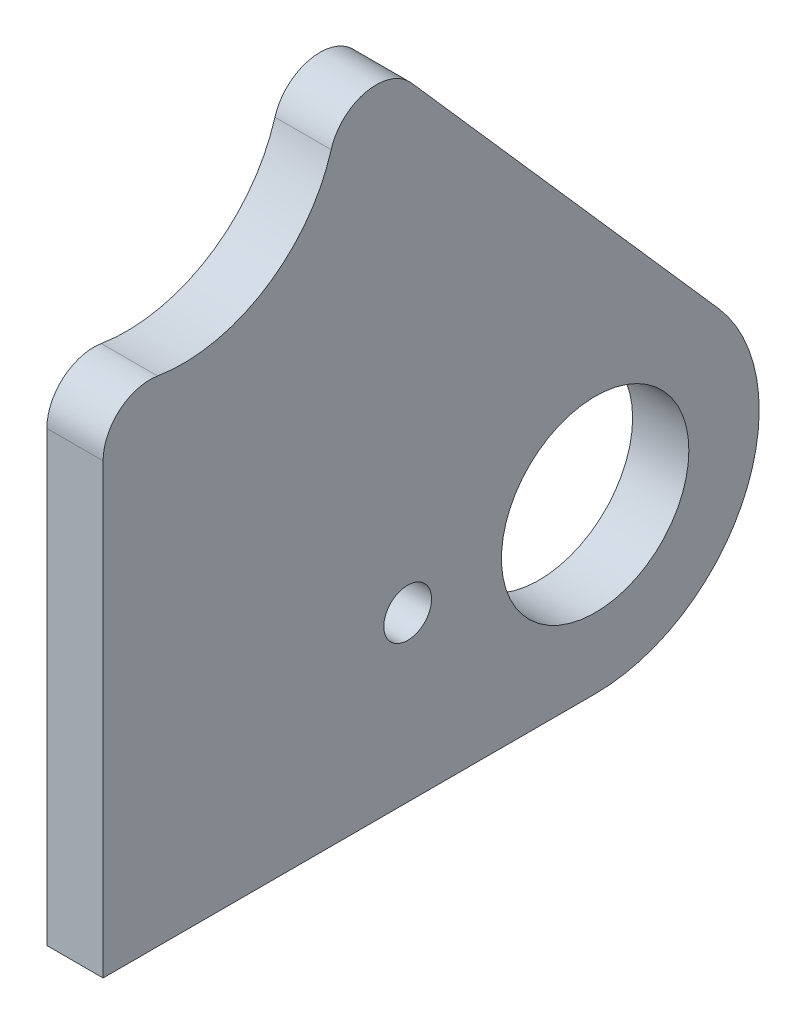
ISO-10303-21;
HEADER;
FILE_DESCRIPTION(('STEP AP214'),'2;1');
FILE_NAME('part.step','',(''),(''),'','','');
FILE_SCHEMA(('AUTOMOTIVE_DESIGN { 1 0 10303 214 1 1 1 1 }'));
ENDSEC;
DATA;
#1=APPLICATION_CONTEXT('core data for automotive mechanical design processes');
#2=APPLICATION_PROTOCOL_DEFINITION('international standard','automotive_design',2000,#1);
#3=PRODUCT_CONTEXT('',#1,'mechanical');
#4=PRODUCT('Part','Part','',(#3));
#5=PRODUCT_RELATED_PRODUCT_CATEGORY('part','',(#4));
#6=PRODUCT_DEFINITION_FORMATION('','',#4);
#7=PRODUCT_DEFINITION_CONTEXT('part definition',#1,'design');
#8=PRODUCT_DEFINITION('design','',#6,#7);
#9=PRODUCT_DEFINITION_SHAPE('','',#8);
#10=(LENGTH_UNIT() NAMED_UNIT(*) SI_UNIT(.MILLI.,.METRE.));
#11=(NAMED_UNIT(*) PLANE_ANGLE_UNIT() SI_UNIT($,.RADIAN.));
#12=(NAMED_UNIT(*) SI_UNIT($,.STERADIAN.) SOLID_ANGLE_UNIT());
#13=UNCERTAINTY_MEASURE_WITH_UNIT(LENGTH_MEASURE(1.E-05),#10,'distance_accuracy_value','');
#14=(GEOMETRIC_REPRESENTATION_CONTEXT(3) GLOBAL_UNCERTAINTY_ASSIGNED_CONTEXT((#13)) GLOBAL_UNIT_ASSIGNED_CONTEXT((#10,
#11,#12)) REPRESENTATION_CONTEXT('',''));
#15=CARTESIAN_POINT('',(0.,0.,0.));
#16=DIRECTION('',(0.,0.,1.));
#17=DIRECTION('',(1.,0.,0.));
#18=AXIS2_PLACEMENT_3D('',#15,#16,#17);
#19=CARTESIAN_POINT('',(12.,35.,-105.));
#20=DIRECTION('',(1.,0.,0.));
#21=DIRECTION('',(0.,0.,-1.));
#22=AXIS2_PLACEMENT_3D('',#19,#20,#21);
#23=PLANE('',#22);
#24=CARTESIAN_POINT('',(12.,35.,-65.));
#25=DIRECTION('',(1.,0.,0.));
#26=DIRECTION('',(0.,0.,-1.));
#27=AXIS2_PLACEMENT_3D('',#24,#25,#26);
#28=CIRCLE('',#27,5.09999999999999);
#29=CARTESIAN_POINT('',(12.,35.,-70.1));
#30=VERTEX_POINT('',#29);
#31=EDGE_CURVE('E174',#30,#30,#28,.T.);
#32=ORIENTED_EDGE('',*,*,#31,.F.);
#33=EDGE_LOOP('',(#32));
#34=FACE_BOUND('',#33,.T.);
#35=DIRECTION('',(0.,0.750625157442999,0.660728289854213));
#36=VECTOR('',#35,1.);
#37=CARTESIAN_POINT('',(12.,159.804033565189,-41.770630195619));
#38=LINE('',#37,#36);
#39=CARTESIAN_POINT('',(12.,58.1254901448974,-131.271880510505));
#40=VERTEX_POINT('',#39);
#41=CARTESIAN_POINT('',(12.,132.532467280468,-65.776081084491));
#42=VERTEX_POINT('',#41);
#43=EDGE_CURVE('E106',#40,#42,#38,.T.);
#44=ORIENTED_EDGE('',*,*,#43,.T.);
#45=CARTESIAN_POINT('',(12.,125.925184381926,-58.269829510061));
#46=DIRECTION('',(1.,0.,0.));
#47=DIRECTION('',(0.,0.,-1.));
#48=AXIS2_PLACEMENT_3D('',#45,#46,#47);
#49=CIRCLE('',#48,10.);
#50=CARTESIAN_POINT('',(12.,128.733281037292,-48.6721947402794));
#51=VERTEX_POINT('',#50);
#52=EDGE_CURVE('E44',#42,#51,#49,.T.);
#53=ORIENTED_EDGE('',*,*,#52,.T.);
#54=CARTESIAN_POINT('',(12.,138.,-17.));
#55=DIRECTION('',(-1.,0.,0.));
#56=DIRECTION('',(0.,0.,-1.));
#57=AXIS2_PLACEMENT_3D('',#54,#55,#56);
#58=CIRCLE('',#57,33.);
#59=CARTESIAN_POINT('',(12.,105.440199377922,-11.6279069767442));
#60=VERTEX_POINT('',#59);
#61=EDGE_CURVE('E137',#51,#60,#58,.T.);
#62=ORIENTED_EDGE('',*,*,#61,.T.);
#63=CARTESIAN_POINT('',(12.,95.5735931288071,-10.));
#64=DIRECTION('',(1.,0.,0.));
#65=DIRECTION('',(0.,0.,-1.));
#66=AXIS2_PLACEMENT_3D('',#63,#64,#65);
#67=CIRCLE('',#66,10.);
#68=CARTESIAN_POINT('',(12.,95.5735931288071,0.));
#69=VERTEX_POINT('',#68);
#70=EDGE_CURVE('E51',#60,#69,#67,.T.);
#71=ORIENTED_EDGE('',*,*,#70,.T.);
#72=DIRECTION('',(0.,-1.,0.));
#73=VECTOR('',#72,1.);
#74=CARTESIAN_POINT('',(12.,0.,0.));
#75=LINE('',#74,#73);
#76=CARTESIAN_POINT('',(12.,0.,0.));
#77=VERTEX_POINT('',#76);
#78=EDGE_CURVE('E111',#69,#77,#75,.T.);
#79=ORIENTED_EDGE('',*,*,#78,.T.);
#80=DIRECTION('',(0.,0.,-1.));
#81=VECTOR('',#80,1.);
#82=CARTESIAN_POINT('',(12.,0.,0.));
#83=LINE('',#82,#81);
#84=CARTESIAN_POINT('',(12.,0.,-105.));
#85=VERTEX_POINT('',#84);
#86=EDGE_CURVE('E107',#77,#85,#83,.T.);
#87=ORIENTED_EDGE('',*,*,#86,.T.);
#88=CARTESIAN_POINT('',(12.,35.,-105.));
#89=DIRECTION('',(1.,0.,0.));
#90=DIRECTION('',(0.,0.,-1.));
#91=AXIS2_PLACEMENT_3D('',#88,#89,#90);
#92=CIRCLE('',#91,35.);
#93=EDGE_CURVE('E98',#85,#40,#92,.T.);
#94=ORIENTED_EDGE('',*,*,#93,.T.);
#95=EDGE_LOOP('',(#44,#53,#62,#71,#79,#87,#94));
#96=FACE_BOUND('',#95,.T.);
#97=CARTESIAN_POINT('',(12.,35.,-105.));
#98=DIRECTION('',(1.,0.,0.));
#99=DIRECTION('',(0.,0.,-1.));
#100=AXIS2_PLACEMENT_3D('',#97,#98,#99);
#101=CIRCLE('',#100,20.);
#102=CARTESIAN_POINT('',(12.,35.,-125.));
#103=VERTEX_POINT('',#102);
#104=EDGE_CURVE('E162',#103,#103,#101,.T.);
#105=ORIENTED_EDGE('',*,*,#104,.F.);
#106=EDGE_LOOP('',(#105));
#107=FACE_BOUND('',#106,.T.);
#108=ADVANCED_FACE('F36',(#34,#96,#107),#23,.T.);
#109=CARTESIAN_POINT('',(0.,35.,-105.));
#110=DIRECTION('',(1.,0.,0.));
#111=DIRECTION('',(0.,0.,-1.));
#112=AXIS2_PLACEMENT_3D('',#109,#110,#111);
#113=PLANE('',#112);
#114=CARTESIAN_POINT('',(0.,35.,-65.));
#115=DIRECTION('',(1.,0.,0.));
#116=DIRECTION('',(0.,0.,-1.));
#117=AXIS2_PLACEMENT_3D('',#114,#115,#116);
#118=CIRCLE('',#117,5.09999999999999);
#119=CARTESIAN_POINT('',(0.,35.,-70.1));
#120=VERTEX_POINT('',#119);
#121=EDGE_CURVE('E169',#120,#120,#118,.T.);
#122=ORIENTED_EDGE('',*,*,#121,.T.);
#123=EDGE_LOOP('',(#122));
#124=FACE_BOUND('',#123,.T.);
#125=CARTESIAN_POINT('',(0.,138.,-17.));
#126=DIRECTION('',(-1.,0.,0.));
#127=DIRECTION('',(0.,0.,-1.));
#128=AXIS2_PLACEMENT_3D('',#125,#126,#127);
#129=CIRCLE('',#128,33.);
#130=CARTESIAN_POINT('',(0.,128.733281037292,-48.6721947402794));
#131=VERTEX_POINT('',#130);
#132=CARTESIAN_POINT('',(0.,105.440199377922,-11.6279069767442));
#133=VERTEX_POINT('',#132);
#134=EDGE_CURVE('E152',#131,#133,#129,.T.);
#135=ORIENTED_EDGE('',*,*,#134,.F.);
#136=CARTESIAN_POINT('',(0.,125.925184381926,-58.269829510061));
#137=DIRECTION('',(1.,0.,0.));
#138=DIRECTION('',(0.,0.,-1.));
#139=AXIS2_PLACEMENT_3D('',#136,#137,#138);
#140=CIRCLE('',#139,10.);
#141=CARTESIAN_POINT('',(0.,132.532467280468,-65.776081084491));
#142=VERTEX_POINT('',#141);
#143=EDGE_CURVE('E132',#131,#142,#140,.F.);
#144=ORIENTED_EDGE('',*,*,#143,.T.);
#145=DIRECTION('',(0.,0.750625157442999,0.660728289854213));
#146=VECTOR('',#145,1.);
#147=CARTESIAN_POINT('',(0.,159.804033565189,-41.770630195619));
#148=LINE('',#147,#146);
#149=CARTESIAN_POINT('',(0.,58.1254901448974,-131.271880510505));
#150=VERTEX_POINT('',#149);
#151=EDGE_CURVE('E151',#150,#142,#148,.T.);
#152=ORIENTED_EDGE('',*,*,#151,.F.);
#153=CARTESIAN_POINT('',(0.,35.,-105.));
#154=DIRECTION('',(1.,0.,0.));
#155=DIRECTION('',(0.,0.,-1.));
#156=AXIS2_PLACEMENT_3D('',#153,#154,#155);
#157=CIRCLE('',#156,35.);
#158=CARTESIAN_POINT('',(0.,0.,-105.));
#159=VERTEX_POINT('',#158);
#160=EDGE_CURVE('E154',#159,#150,#157,.T.);
#161=ORIENTED_EDGE('',*,*,#160,.F.);
#162=DIRECTION('',(0.,0.,-1.));
#163=VECTOR('',#162,1.);
#164=CARTESIAN_POINT('',(0.,0.,0.));
#165=LINE('',#164,#163);
#166=CARTESIAN_POINT('',(0.,0.,0.));
#167=VERTEX_POINT('',#166);
#168=EDGE_CURVE('E119',#167,#159,#165,.T.);
#169=ORIENTED_EDGE('',*,*,#168,.F.);
#170=DIRECTION('',(0.,-1.,0.));
#171=VECTOR('',#170,1.);
#172=CARTESIAN_POINT('',(0.,0.,0.));
#173=LINE('',#172,#171);
#174=CARTESIAN_POINT('',(0.,95.5735931288071,0.));
#175=VERTEX_POINT('',#174);
#176=EDGE_CURVE('E115',#175,#167,#173,.T.);
#177=ORIENTED_EDGE('',*,*,#176,.F.);
#178=CARTESIAN_POINT('',(0.,95.5735931288071,-10.));
#179=DIRECTION('',(1.,0.,0.));
#180=DIRECTION('',(0.,0.,-1.));
#181=AXIS2_PLACEMENT_3D('',#178,#179,#180);
#182=CIRCLE('',#181,10.);
#183=EDGE_CURVE('E130',#175,#133,#182,.F.);
#184=ORIENTED_EDGE('',*,*,#183,.T.);
#185=EDGE_LOOP('',(#135,#144,#152,#161,#169,#177,#184));
#186=FACE_BOUND('',#185,.T.);
#187=CARTESIAN_POINT('',(0.,35.,-105.));
#188=DIRECTION('',(1.,0.,0.));
#189=DIRECTION('',(0.,0.,-1.));
#190=AXIS2_PLACEMENT_3D('',#187,#188,#189);
#191=CIRCLE('',#190,20.);
#192=CARTESIAN_POINT('',(0.,35.,-125.));
#193=VERTEX_POINT('',#192);
#194=EDGE_CURVE('E164',#193,#193,#191,.T.);
#195=ORIENTED_EDGE('',*,*,#194,.T.);
#196=EDGE_LOOP('',(#195));
#197=FACE_BOUND('',#196,.T.);
#198=ADVANCED_FACE('F149',(#124,#186,#197),#113,.F.);
#199=CARTESIAN_POINT('',(12.,0.,0.));
#200=DIRECTION('',(0.,1.,0.));
#201=DIRECTION('',(0.,0.,1.));
#202=AXIS2_PLACEMENT_3D('',#199,#200,#201);
#203=PLANE('',#202);
#204=ORIENTED_EDGE('',*,*,#168,.T.);
#205=DIRECTION('',(-1.,0.,0.));
#206=VECTOR('',#205,1.);
#207=CARTESIAN_POINT('',(12.,0.,-105.));
#208=LINE('',#207,#206);
#209=EDGE_CURVE('E102',#85,#159,#208,.T.);
#210=ORIENTED_EDGE('',*,*,#209,.F.);
#211=ORIENTED_EDGE('',*,*,#86,.F.);
#212=DIRECTION('',(-1.,0.,0.));
#213=VECTOR('',#212,1.);
#214=CARTESIAN_POINT('',(12.,0.,0.));
#215=LINE('',#214,#213);
#216=EDGE_CURVE('E124',#77,#167,#215,.T.);
#217=ORIENTED_EDGE('',*,*,#216,.T.);
#218=EDGE_LOOP('',(#204,#210,#211,#217));
#219=FACE_BOUND('',#218,.T.);
#220=ADVANCED_FACE('F117',(#219),#203,.F.);
#221=CARTESIAN_POINT('',(12.,35.,-105.));
#222=DIRECTION('',(-1.,0.,0.));
#223=DIRECTION('',(0.,0.,1.));
#224=AXIS2_PLACEMENT_3D('',#221,#222,#223);
#225=CYLINDRICAL_SURFACE('',#224,35.);
#226=ORIENTED_EDGE('',*,*,#160,.T.);
#227=DIRECTION('',(-1.,0.,0.));
#228=VECTOR('',#227,1.);
#229=CARTESIAN_POINT('',(12.,58.1254901448974,-131.271880510505));
#230=LINE('',#229,#228);
#231=EDGE_CURVE('E105',#40,#150,#230,.T.);
#232=ORIENTED_EDGE('',*,*,#231,.F.);
#233=ORIENTED_EDGE('',*,*,#93,.F.);
#234=ORIENTED_EDGE('',*,*,#209,.T.);
#235=EDGE_LOOP('',(#226,#232,#233,#234));
#236=FACE_BOUND('',#235,.T.);
#237=ADVANCED_FACE('F100',(#236),#225,.T.);
#238=CARTESIAN_POINT('',(12.,159.804033565189,-41.770630195619));
#239=DIRECTION('',(0.,-0.660728289854213,0.750625157442999));
#240=DIRECTION('',(0.,-0.750625157442999,-0.660728289854213));
#241=AXIS2_PLACEMENT_3D('',#238,#239,#240);
#242=PLANE('',#241);
#243=ORIENTED_EDGE('',*,*,#151,.T.);
#244=DIRECTION('',(-1.,0.,0.));
#245=VECTOR('',#244,1.);
#246=CARTESIAN_POINT('',(12.,132.532467280468,-65.776081084491));
#247=LINE('',#246,#245);
#248=EDGE_CURVE('E59',#142,#42,#247,.F.);
#249=ORIENTED_EDGE('',*,*,#248,.T.);
#250=ORIENTED_EDGE('',*,*,#43,.F.);
#251=ORIENTED_EDGE('',*,*,#231,.T.);
#252=EDGE_LOOP('',(#243,#249,#250,#251));
#253=FACE_BOUND('',#252,.T.);
#254=ADVANCED_FACE('F153',(#253),#242,.F.);
#255=CARTESIAN_POINT('',(12.,138.,-17.));
#256=DIRECTION('',(-1.,0.,0.));
#257=DIRECTION('',(0.,0.,1.));
#258=AXIS2_PLACEMENT_3D('',#255,#256,#257);
#259=CYLINDRICAL_SURFACE('',#258,33.);
#260=ORIENTED_EDGE('',*,*,#61,.F.);
#261=DIRECTION('',(-1.,0.,0.));
#262=VECTOR('',#261,1.);
#263=CARTESIAN_POINT('',(12.,128.733281037292,-48.6721947402794));
#264=LINE('',#263,#262);
#265=EDGE_CURVE('E122',#51,#131,#264,.T.);
#266=ORIENTED_EDGE('',*,*,#265,.T.);
#267=ORIENTED_EDGE('',*,*,#134,.T.);
#268=DIRECTION('',(-1.,0.,0.));
#269=VECTOR('',#268,1.);
#270=CARTESIAN_POINT('',(12.,105.440199377922,-11.6279069767442));
#271=LINE('',#270,#269);
#272=EDGE_CURVE('E120',#133,#60,#271,.F.);
#273=ORIENTED_EDGE('',*,*,#272,.T.);
#274=EDGE_LOOP('',(#260,#266,#267,#273));
#275=FACE_BOUND('',#274,.T.);
#276=ADVANCED_FACE('F141',(#275),#259,.F.);
#277=CARTESIAN_POINT('',(12.,0.,0.));
#278=DIRECTION('',(0.,0.,-1.));
#279=DIRECTION('',(-1.,0.,0.));
#280=AXIS2_PLACEMENT_3D('',#277,#278,#279);
#281=PLANE('',#280);
#282=ORIENTED_EDGE('',*,*,#78,.F.);
#283=DIRECTION('',(-1.,0.,0.));
#284=VECTOR('',#283,1.);
#285=CARTESIAN_POINT('',(12.,95.5735931288071,0.));
#286=LINE('',#285,#284);
#287=EDGE_CURVE('E11',#69,#175,#286,.T.);
#288=ORIENTED_EDGE('',*,*,#287,.T.);
#289=ORIENTED_EDGE('',*,*,#176,.T.);
#290=ORIENTED_EDGE('',*,*,#216,.F.);
#291=EDGE_LOOP('',(#282,#288,#289,#290));
#292=FACE_BOUND('',#291,.T.);
#293=ADVANCED_FACE('F191',(#292),#281,.F.);
#294=CARTESIAN_POINT('',(12.,35.,-105.));
#295=DIRECTION('',(-1.,0.,0.));
#296=DIRECTION('',(0.,0.,1.));
#297=AXIS2_PLACEMENT_3D('',#294,#295,#296);
#298=CYLINDRICAL_SURFACE('',#297,20.);
#299=ORIENTED_EDGE('',*,*,#104,.T.);
#300=EDGE_LOOP('',(#299));
#301=FACE_BOUND('',#300,.T.);
#302=ORIENTED_EDGE('',*,*,#194,.F.);
#303=EDGE_LOOP('',(#302));
#304=FACE_BOUND('',#303,.T.);
#305=ADVANCED_FACE('F188',(#301,#304),#298,.F.);
#306=CARTESIAN_POINT('',(12.,125.925184381926,-58.269829510061));
#307=DIRECTION('',(-1.,0.,0.));
#308=DIRECTION('',(0.,0.,1.));
#309=AXIS2_PLACEMENT_3D('',#306,#307,#308);
#310=CYLINDRICAL_SURFACE('',#309,10.);
#311=ORIENTED_EDGE('',*,*,#52,.F.);
#312=ORIENTED_EDGE('',*,*,#248,.F.);
#313=ORIENTED_EDGE('',*,*,#143,.F.);
#314=ORIENTED_EDGE('',*,*,#265,.F.);
#315=EDGE_LOOP('',(#311,#312,#313,#314));
#316=FACE_BOUND('',#315,.T.);
#317=ADVANCED_FACE('F146',(#316),#310,.T.);
#318=CARTESIAN_POINT('',(12.,95.5735931288071,-10.));
#319=DIRECTION('',(-1.,0.,0.));
#320=DIRECTION('',(0.,0.,1.));
#321=AXIS2_PLACEMENT_3D('',#318,#319,#320);
#322=CYLINDRICAL_SURFACE('',#321,10.);
#323=ORIENTED_EDGE('',*,*,#70,.F.);
#324=ORIENTED_EDGE('',*,*,#272,.F.);
#325=ORIENTED_EDGE('',*,*,#183,.F.);
#326=ORIENTED_EDGE('',*,*,#287,.F.);
#327=EDGE_LOOP('',(#323,#324,#325,#326));
#328=FACE_BOUND('',#327,.T.);
#329=ADVANCED_FACE('F38',(#328),#322,.T.);
#330=CARTESIAN_POINT('',(12.,35.,-65.));
#331=DIRECTION('',(1.,0.,0.));
#332=DIRECTION('',(0.,0.,-1.));
#333=AXIS2_PLACEMENT_3D('',#330,#331,#332);
#334=CYLINDRICAL_SURFACE('',#333,5.09999999999999);
#335=ORIENTED_EDGE('',*,*,#121,.F.);
#336=EDGE_LOOP('',(#335));
#337=FACE_BOUND('',#336,.T.);
#338=ORIENTED_EDGE('',*,*,#31,.T.);
#339=EDGE_LOOP('',(#338));
#340=FACE_BOUND('',#339,.T.);
#341=ADVANCED_FACE('F178',(#337,#340),#334,.F.);
#342=CLOSED_SHELL('',(#108,#198,#220,#237,#254,#276,#293,#305,#317,#329,#341));
#343=MANIFOLD_SOLID_BREP('B2',#342);
#344=ADVANCED_BREP_SHAPE_REPRESENTATION('',(#18,#343),#14);
#345=SHAPE_DEFINITION_REPRESENTATION(#9,#344);
ENDSEC;
END-ISO-10303-21;
